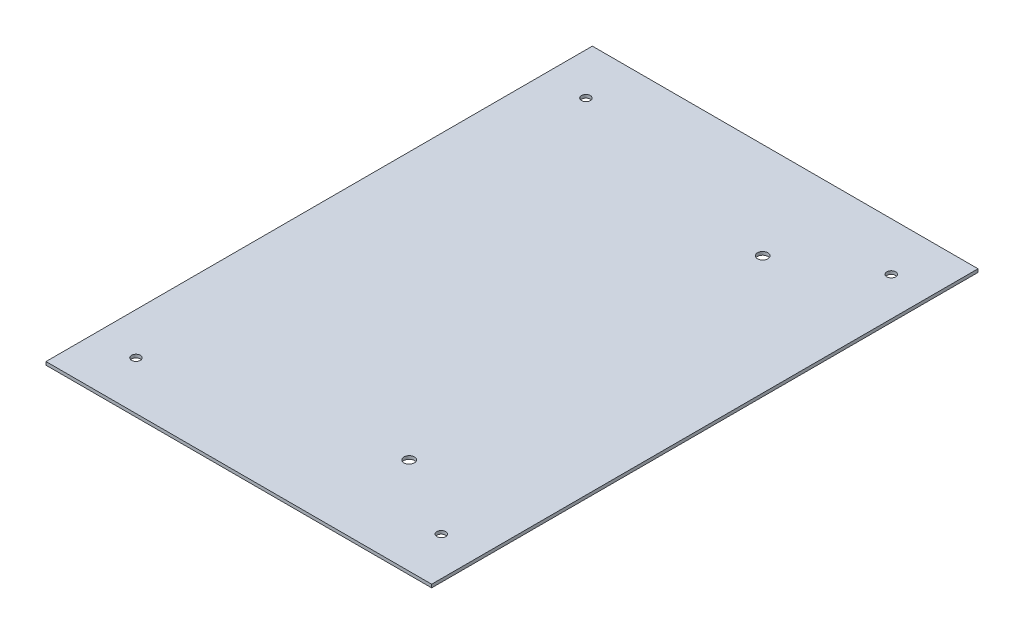
ISO-10303-21;
HEADER;
FILE_DESCRIPTION(('STEP AP214'),'2;1');
FILE_NAME('part.step','',(''),(''),'','','');
FILE_SCHEMA(('AUTOMOTIVE_DESIGN { 1 0 10303 214 1 1 1 1 }'));
ENDSEC;
DATA;
#1=APPLICATION_CONTEXT('core data for automotive mechanical design processes');
#2=APPLICATION_PROTOCOL_DEFINITION('international standard','automotive_design',2000,#1);
#3=PRODUCT_CONTEXT('',#1,'mechanical');
#4=PRODUCT('Part','Part','',(#3));
#5=PRODUCT_RELATED_PRODUCT_CATEGORY('part','',(#4));
#6=PRODUCT_DEFINITION_FORMATION('','',#4);
#7=PRODUCT_DEFINITION_CONTEXT('part definition',#1,'design');
#8=PRODUCT_DEFINITION('design','',#6,#7);
#9=PRODUCT_DEFINITION_SHAPE('','',#8);
#10=(LENGTH_UNIT() NAMED_UNIT(*) SI_UNIT(.MILLI.,.METRE.));
#11=(NAMED_UNIT(*) PLANE_ANGLE_UNIT() SI_UNIT($,.RADIAN.));
#12=(NAMED_UNIT(*) SI_UNIT($,.STERADIAN.) SOLID_ANGLE_UNIT());
#13=UNCERTAINTY_MEASURE_WITH_UNIT(LENGTH_MEASURE(1.E-05),#10,'distance_accuracy_value','');
#14=(GEOMETRIC_REPRESENTATION_CONTEXT(3) GLOBAL_UNCERTAINTY_ASSIGNED_CONTEXT((#13)) GLOBAL_UNIT_ASSIGNED_CONTEXT((#10,
#11,#12)) REPRESENTATION_CONTEXT('',''));
#15=CARTESIAN_POINT('',(0.,0.,0.));
#16=DIRECTION('',(0.,0.,1.));
#17=DIRECTION('',(1.,0.,0.));
#18=AXIS2_PLACEMENT_3D('',#15,#16,#17);
#19=CARTESIAN_POINT('',(0.,0.,340.));
#20=DIRECTION('',(-1.,0.,0.));
#21=DIRECTION('',(0.,0.,1.));
#22=AXIS2_PLACEMENT_3D('',#19,#20,#21);
#23=PLANE('',#22);
#24=DIRECTION('',(0.,0.,-1.));
#25=VECTOR('',#24,1.);
#26=CARTESIAN_POINT('',(0.,0.,340.));
#27=LINE('',#26,#25);
#28=CARTESIAN_POINT('',(0.,0.,340.));
#29=VERTEX_POINT('',#28);
#30=CARTESIAN_POINT('',(0.,0.,0.));
#31=VERTEX_POINT('',#30);
#32=EDGE_CURVE('E45',#29,#31,#27,.T.);
#33=ORIENTED_EDGE('',*,*,#32,.F.);
#34=DIRECTION('',(0.,1.,0.));
#35=VECTOR('',#34,1.);
#36=CARTESIAN_POINT('',(0.,0.,340.));
#37=LINE('',#36,#35);
#38=CARTESIAN_POINT('',(0.,2.00000000000003,340.));
#39=VERTEX_POINT('',#38);
#40=EDGE_CURVE('E74',#29,#39,#37,.T.);
#41=ORIENTED_EDGE('',*,*,#40,.T.);
#42=DIRECTION('',(0.,0.,-1.));
#43=VECTOR('',#42,1.);
#44=CARTESIAN_POINT('',(0.,2.00000000000003,340.));
#45=LINE('',#44,#43);
#46=CARTESIAN_POINT('',(0.,2.00000000000003,0.));
#47=VERTEX_POINT('',#46);
#48=EDGE_CURVE('E70',#39,#47,#45,.T.);
#49=ORIENTED_EDGE('',*,*,#48,.T.);
#50=DIRECTION('',(0.,1.,0.));
#51=VECTOR('',#50,1.);
#52=CARTESIAN_POINT('',(0.,0.,0.));
#53=LINE('',#52,#51);
#54=EDGE_CURVE('E72',#31,#47,#53,.T.);
#55=ORIENTED_EDGE('',*,*,#54,.F.);
#56=EDGE_LOOP('',(#33,#41,#49,#55));
#57=FACE_BOUND('',#56,.T.);
#58=ADVANCED_FACE('F30',(#57),#23,.T.);
#59=CARTESIAN_POINT('',(0.,0.,340.));
#60=DIRECTION('',(0.,1.,0.));
#61=DIRECTION('',(-1.,0.,0.));
#62=AXIS2_PLACEMENT_3D('',#59,#60,#61);
#63=PLANE('',#62);
#64=CARTESIAN_POINT('',(166.,-1.16226472890446E-13,60.));
#65=DIRECTION('',(0.,1.,0.));
#66=DIRECTION('',(-1.,0.,0.));
#67=AXIS2_PLACEMENT_3D('',#64,#65,#66);
#68=CIRCLE('',#67,3.25000000000001);
#69=CARTESIAN_POINT('',(162.75,-1.15228103389949E-13,60.));
#70=VERTEX_POINT('',#69);
#71=EDGE_CURVE('E179',#70,#70,#68,.T.);
#72=ORIENTED_EDGE('',*,*,#71,.T.);
#73=EDGE_LOOP('',(#72));
#74=FACE_BOUND('',#73,.T.);
#75=CARTESIAN_POINT('',(166.,-1.16226472890446E-13,280.));
#76=DIRECTION('',(0.,1.,0.));
#77=DIRECTION('',(-1.,0.,0.));
#78=AXIS2_PLACEMENT_3D('',#75,#76,#77);
#79=CIRCLE('',#78,3.25000000000001);
#80=CARTESIAN_POINT('',(162.75,-1.15228103389949E-13,280.));
#81=VERTEX_POINT('',#80);
#82=EDGE_CURVE('E189',#81,#81,#79,.T.);
#83=ORIENTED_EDGE('',*,*,#82,.T.);
#84=EDGE_LOOP('',(#83));
#85=FACE_BOUND('',#84,.T.);
#86=CARTESIAN_POINT('',(26.,0.,30.));
#87=DIRECTION('',(0.,1.,0.));
#88=DIRECTION('',(-1.,0.,0.));
#89=AXIS2_PLACEMENT_3D('',#86,#87,#88);
#90=CIRCLE('',#89,2.75000000000001);
#91=CARTESIAN_POINT('',(23.25,0.,30.));
#92=VERTEX_POINT('',#91);
#93=EDGE_CURVE('E192',#92,#92,#90,.T.);
#94=ORIENTED_EDGE('',*,*,#93,.T.);
#95=EDGE_LOOP('',(#94));
#96=FACE_BOUND('',#95,.T.);
#97=CARTESIAN_POINT('',(216.,0.,30.));
#98=DIRECTION('',(0.,1.,0.));
#99=DIRECTION('',(-1.,0.,0.));
#100=AXIS2_PLACEMENT_3D('',#97,#98,#99);
#101=CIRCLE('',#100,2.75000000000001);
#102=CARTESIAN_POINT('',(213.25,0.,30.));
#103=VERTEX_POINT('',#102);
#104=EDGE_CURVE('E89',#103,#103,#101,.T.);
#105=ORIENTED_EDGE('',*,*,#104,.T.);
#106=EDGE_LOOP('',(#105));
#107=FACE_BOUND('',#106,.T.);
#108=DIRECTION('',(0.,0.,-1.));
#109=VECTOR('',#108,1.);
#110=CARTESIAN_POINT('',(240.,0.,340.));
#111=LINE('',#110,#109);
#112=CARTESIAN_POINT('',(240.,0.,340.));
#113=VERTEX_POINT('',#112);
#114=CARTESIAN_POINT('',(240.,0.,0.));
#115=VERTEX_POINT('',#114);
#116=EDGE_CURVE('E53',#113,#115,#111,.T.);
#117=ORIENTED_EDGE('',*,*,#116,.F.);
#118=DIRECTION('',(1.,0.,0.));
#119=VECTOR('',#118,1.);
#120=CARTESIAN_POINT('',(0.,0.,340.));
#121=LINE('',#120,#119);
#122=EDGE_CURVE('E80',#29,#113,#121,.T.);
#123=ORIENTED_EDGE('',*,*,#122,.F.);
#124=ORIENTED_EDGE('',*,*,#32,.T.);
#125=DIRECTION('',(1.,0.,0.));
#126=VECTOR('',#125,1.);
#127=CARTESIAN_POINT('',(0.,0.,0.));
#128=LINE('',#127,#126);
#129=EDGE_CURVE('E88',#31,#115,#128,.T.);
#130=ORIENTED_EDGE('',*,*,#129,.T.);
#131=EDGE_LOOP('',(#117,#123,#124,#130));
#132=FACE_BOUND('',#131,.T.);
#133=CARTESIAN_POINT('',(216.,0.,310.));
#134=DIRECTION('',(0.,1.,0.));
#135=DIRECTION('',(-1.,0.,0.));
#136=AXIS2_PLACEMENT_3D('',#133,#134,#135);
#137=CIRCLE('',#136,2.75000000000001);
#138=CARTESIAN_POINT('',(213.25,0.,310.));
#139=VERTEX_POINT('',#138);
#140=EDGE_CURVE('E109',#139,#139,#137,.T.);
#141=ORIENTED_EDGE('',*,*,#140,.T.);
#142=EDGE_LOOP('',(#141));
#143=FACE_BOUND('',#142,.T.);
#144=CARTESIAN_POINT('',(26.,0.,310.));
#145=DIRECTION('',(0.,1.,0.));
#146=DIRECTION('',(-1.,0.,0.));
#147=AXIS2_PLACEMENT_3D('',#144,#145,#146);
#148=CIRCLE('',#147,2.75000000000001);
#149=CARTESIAN_POINT('',(23.25,0.,310.));
#150=VERTEX_POINT('',#149);
#151=EDGE_CURVE('E34',#150,#150,#148,.T.);
#152=ORIENTED_EDGE('',*,*,#151,.T.);
#153=EDGE_LOOP('',(#152));
#154=FACE_BOUND('',#153,.T.);
#155=ADVANCED_FACE('F116',(#74,#85,#96,#107,#132,#143,#154),#63,.F.);
#156=CARTESIAN_POINT('',(240.,1.99999999999996,340.));
#157=DIRECTION('',(1.,0.,0.));
#158=DIRECTION('',(0.,0.,-1.));
#159=AXIS2_PLACEMENT_3D('',#156,#157,#158);
#160=PLANE('',#159);
#161=DIRECTION('',(0.,0.,-1.));
#162=VECTOR('',#161,1.);
#163=CARTESIAN_POINT('',(240.,1.99999999999996,340.));
#164=LINE('',#163,#162);
#165=CARTESIAN_POINT('',(240.,1.99999999999996,340.));
#166=VERTEX_POINT('',#165);
#167=CARTESIAN_POINT('',(240.,1.99999999999996,0.));
#168=VERTEX_POINT('',#167);
#169=EDGE_CURVE('E79',#166,#168,#164,.T.);
#170=ORIENTED_EDGE('',*,*,#169,.F.);
#171=DIRECTION('',(0.,-1.,0.));
#172=VECTOR('',#171,1.);
#173=CARTESIAN_POINT('',(240.,1.99999999999996,340.));
#174=LINE('',#173,#172);
#175=EDGE_CURVE('E102',#166,#113,#174,.T.);
#176=ORIENTED_EDGE('',*,*,#175,.T.);
#177=ORIENTED_EDGE('',*,*,#116,.T.);
#178=DIRECTION('',(0.,-1.,0.));
#179=VECTOR('',#178,1.);
#180=CARTESIAN_POINT('',(240.,1.99999999999996,0.));
#181=LINE('',#180,#179);
#182=EDGE_CURVE('E93',#168,#115,#181,.T.);
#183=ORIENTED_EDGE('',*,*,#182,.F.);
#184=EDGE_LOOP('',(#170,#176,#177,#183));
#185=FACE_BOUND('',#184,.T.);
#186=ADVANCED_FACE('F127',(#185),#160,.T.);
#187=CARTESIAN_POINT('',(240.,1.99999999999996,340.));
#188=DIRECTION('',(0.,-1.,0.));
#189=DIRECTION('',(1.,0.,0.));
#190=AXIS2_PLACEMENT_3D('',#187,#188,#189);
#191=PLANE('',#190);
#192=CARTESIAN_POINT('',(166.,1.99999999999998,60.));
#193=DIRECTION('',(0.,1.,0.));
#194=DIRECTION('',(-1.,0.,0.));
#195=AXIS2_PLACEMENT_3D('',#192,#193,#194);
#196=CIRCLE('',#195,3.25000000000001);
#197=CARTESIAN_POINT('',(162.75,1.99999999999998,60.));
#198=VERTEX_POINT('',#197);
#199=EDGE_CURVE('E182',#198,#198,#196,.T.);
#200=ORIENTED_EDGE('',*,*,#199,.F.);
#201=EDGE_LOOP('',(#200));
#202=FACE_BOUND('',#201,.T.);
#203=CARTESIAN_POINT('',(166.,1.99999999999998,280.));
#204=DIRECTION('',(0.,1.,0.));
#205=DIRECTION('',(-1.,0.,0.));
#206=AXIS2_PLACEMENT_3D('',#203,#204,#205);
#207=CIRCLE('',#206,3.25000000000001);
#208=CARTESIAN_POINT('',(162.75,1.99999999999998,280.));
#209=VERTEX_POINT('',#208);
#210=EDGE_CURVE('E184',#209,#209,#207,.T.);
#211=ORIENTED_EDGE('',*,*,#210,.F.);
#212=EDGE_LOOP('',(#211));
#213=FACE_BOUND('',#212,.T.);
#214=CARTESIAN_POINT('',(26.,2.00000000000002,30.));
#215=DIRECTION('',(0.,1.,0.));
#216=DIRECTION('',(-1.,0.,0.));
#217=AXIS2_PLACEMENT_3D('',#214,#215,#216);
#218=CIRCLE('',#217,2.75000000000001);
#219=CARTESIAN_POINT('',(23.25,2.00000000000002,30.));
#220=VERTEX_POINT('',#219);
#221=EDGE_CURVE('E195',#220,#220,#218,.T.);
#222=ORIENTED_EDGE('',*,*,#221,.F.);
#223=EDGE_LOOP('',(#222));
#224=FACE_BOUND('',#223,.T.);
#225=CARTESIAN_POINT('',(216.,1.99999999999996,30.));
#226=DIRECTION('',(0.,1.,0.));
#227=DIRECTION('',(-1.,0.,0.));
#228=AXIS2_PLACEMENT_3D('',#225,#226,#227);
#229=CIRCLE('',#228,2.75000000000001);
#230=CARTESIAN_POINT('',(213.25,1.99999999999996,30.));
#231=VERTEX_POINT('',#230);
#232=EDGE_CURVE('E198',#231,#231,#229,.T.);
#233=ORIENTED_EDGE('',*,*,#232,.F.);
#234=EDGE_LOOP('',(#233));
#235=FACE_BOUND('',#234,.T.);
#236=DIRECTION('',(-1.,0.,0.));
#237=VECTOR('',#236,1.);
#238=CARTESIAN_POINT('',(240.,1.99999999999996,340.));
#239=LINE('',#238,#237);
#240=EDGE_CURVE('E100',#166,#39,#239,.T.);
#241=ORIENTED_EDGE('',*,*,#240,.F.);
#242=ORIENTED_EDGE('',*,*,#169,.T.);
#243=DIRECTION('',(-1.,0.,0.));
#244=VECTOR('',#243,1.);
#245=CARTESIAN_POINT('',(240.,1.99999999999996,0.));
#246=LINE('',#245,#244);
#247=EDGE_CURVE('E86',#168,#47,#246,.T.);
#248=ORIENTED_EDGE('',*,*,#247,.T.);
#249=ORIENTED_EDGE('',*,*,#48,.F.);
#250=EDGE_LOOP('',(#241,#242,#248,#249));
#251=FACE_BOUND('',#250,.T.);
#252=CARTESIAN_POINT('',(216.,1.99999999999996,310.));
#253=DIRECTION('',(0.,1.,0.));
#254=DIRECTION('',(-1.,0.,0.));
#255=AXIS2_PLACEMENT_3D('',#252,#253,#254);
#256=CIRCLE('',#255,2.75000000000001);
#257=CARTESIAN_POINT('',(213.25,1.99999999999996,310.));
#258=VERTEX_POINT('',#257);
#259=EDGE_CURVE('E110',#258,#258,#256,.T.);
#260=ORIENTED_EDGE('',*,*,#259,.F.);
#261=EDGE_LOOP('',(#260));
#262=FACE_BOUND('',#261,.T.);
#263=CARTESIAN_POINT('',(26.,2.00000000000002,310.));
#264=DIRECTION('',(0.,1.,0.));
#265=DIRECTION('',(-1.,0.,0.));
#266=AXIS2_PLACEMENT_3D('',#263,#264,#265);
#267=CIRCLE('',#266,2.75000000000001);
#268=CARTESIAN_POINT('',(23.25,2.00000000000002,310.));
#269=VERTEX_POINT('',#268);
#270=EDGE_CURVE('E11',#269,#269,#267,.T.);
#271=ORIENTED_EDGE('',*,*,#270,.F.);
#272=EDGE_LOOP('',(#271));
#273=FACE_BOUND('',#272,.T.);
#274=ADVANCED_FACE('F91',(#202,#213,#224,#235,#251,#262,#273),#191,.F.);
#275=CARTESIAN_POINT('',(0.,0.,340.));
#276=DIRECTION('',(0.,0.,-1.));
#277=DIRECTION('',(-1.,0.,0.));
#278=AXIS2_PLACEMENT_3D('',#275,#276,#277);
#279=PLANE('',#278);
#280=ORIENTED_EDGE('',*,*,#40,.F.);
#281=ORIENTED_EDGE('',*,*,#122,.T.);
#282=ORIENTED_EDGE('',*,*,#175,.F.);
#283=ORIENTED_EDGE('',*,*,#240,.T.);
#284=EDGE_LOOP('',(#280,#281,#282,#283));
#285=FACE_BOUND('',#284,.T.);
#286=ADVANCED_FACE('F126',(#285),#279,.F.);
#287=CARTESIAN_POINT('',(0.,0.,0.));
#288=DIRECTION('',(0.,0.,-1.));
#289=DIRECTION('',(-1.,0.,0.));
#290=AXIS2_PLACEMENT_3D('',#287,#288,#289);
#291=PLANE('',#290);
#292=ORIENTED_EDGE('',*,*,#54,.T.);
#293=ORIENTED_EDGE('',*,*,#247,.F.);
#294=ORIENTED_EDGE('',*,*,#182,.T.);
#295=ORIENTED_EDGE('',*,*,#129,.F.);
#296=EDGE_LOOP('',(#292,#293,#294,#295));
#297=FACE_BOUND('',#296,.T.);
#298=ADVANCED_FACE('F84',(#297),#291,.T.);
#299=CARTESIAN_POINT('',(216.,0.,30.));
#300=DIRECTION('',(0.,1.,0.));
#301=DIRECTION('',(-1.,0.,0.));
#302=AXIS2_PLACEMENT_3D('',#299,#300,#301);
#303=CYLINDRICAL_SURFACE('',#302,2.75000000000001);
#304=ORIENTED_EDGE('',*,*,#104,.F.);
#305=EDGE_LOOP('',(#304));
#306=FACE_BOUND('',#305,.T.);
#307=ORIENTED_EDGE('',*,*,#232,.T.);
#308=EDGE_LOOP('',(#307));
#309=FACE_BOUND('',#308,.T.);
#310=ADVANCED_FACE('F161',(#306,#309),#303,.F.);
#311=CARTESIAN_POINT('',(26.,0.,30.));
#312=DIRECTION('',(0.,1.,0.));
#313=DIRECTION('',(-1.,0.,0.));
#314=AXIS2_PLACEMENT_3D('',#311,#312,#313);
#315=CYLINDRICAL_SURFACE('',#314,2.75000000000001);
#316=ORIENTED_EDGE('',*,*,#93,.F.);
#317=EDGE_LOOP('',(#316));
#318=FACE_BOUND('',#317,.T.);
#319=ORIENTED_EDGE('',*,*,#221,.T.);
#320=EDGE_LOOP('',(#319));
#321=FACE_BOUND('',#320,.T.);
#322=ADVANCED_FACE('F122',(#318,#321),#315,.F.);
#323=CARTESIAN_POINT('',(216.,0.,310.));
#324=DIRECTION('',(0.,1.,0.));
#325=DIRECTION('',(-1.,0.,0.));
#326=AXIS2_PLACEMENT_3D('',#323,#324,#325);
#327=CYLINDRICAL_SURFACE('',#326,2.75000000000001);
#328=ORIENTED_EDGE('',*,*,#140,.F.);
#329=EDGE_LOOP('',(#328));
#330=FACE_BOUND('',#329,.T.);
#331=ORIENTED_EDGE('',*,*,#259,.T.);
#332=EDGE_LOOP('',(#331));
#333=FACE_BOUND('',#332,.T.);
#334=ADVANCED_FACE('F119',(#330,#333),#327,.F.);
#335=CARTESIAN_POINT('',(26.,0.,310.));
#336=DIRECTION('',(0.,1.,0.));
#337=DIRECTION('',(-1.,0.,0.));
#338=AXIS2_PLACEMENT_3D('',#335,#336,#337);
#339=CYLINDRICAL_SURFACE('',#338,2.75000000000001);
#340=ORIENTED_EDGE('',*,*,#151,.F.);
#341=EDGE_LOOP('',(#340));
#342=FACE_BOUND('',#341,.T.);
#343=ORIENTED_EDGE('',*,*,#270,.T.);
#344=EDGE_LOOP('',(#343));
#345=FACE_BOUND('',#344,.T.);
#346=ADVANCED_FACE('F32',(#342,#345),#339,.F.);
#347=CARTESIAN_POINT('',(166.,-1.16226472890446E-13,280.));
#348=DIRECTION('',(0.,1.,0.));
#349=DIRECTION('',(-1.,0.,0.));
#350=AXIS2_PLACEMENT_3D('',#347,#348,#349);
#351=CYLINDRICAL_SURFACE('',#350,3.25000000000001);
#352=ORIENTED_EDGE('',*,*,#82,.F.);
#353=EDGE_LOOP('',(#352));
#354=FACE_BOUND('',#353,.T.);
#355=ORIENTED_EDGE('',*,*,#210,.T.);
#356=EDGE_LOOP('',(#355));
#357=FACE_BOUND('',#356,.T.);
#358=ADVANCED_FACE('F133',(#354,#357),#351,.F.);
#359=CARTESIAN_POINT('',(166.,-1.16226472890446E-13,60.));
#360=DIRECTION('',(0.,1.,0.));
#361=DIRECTION('',(-1.,0.,0.));
#362=AXIS2_PLACEMENT_3D('',#359,#360,#361);
#363=CYLINDRICAL_SURFACE('',#362,3.25000000000001);
#364=ORIENTED_EDGE('',*,*,#71,.F.);
#365=EDGE_LOOP('',(#364));
#366=FACE_BOUND('',#365,.T.);
#367=ORIENTED_EDGE('',*,*,#199,.T.);
#368=EDGE_LOOP('',(#367));
#369=FACE_BOUND('',#368,.T.);
#370=ADVANCED_FACE('F138',(#366,#369),#363,.F.);
#371=CLOSED_SHELL('',(#58,#155,#186,#274,#286,#298,#310,#322,#334,#346,#358,#370));
#372=MANIFOLD_SOLID_BREP('B2',#371);
#373=ADVANCED_BREP_SHAPE_REPRESENTATION('',(#18,#372),#14);
#374=SHAPE_DEFINITION_REPRESENTATION(#9,#373);
ENDSEC;
END-ISO-10303-21;
